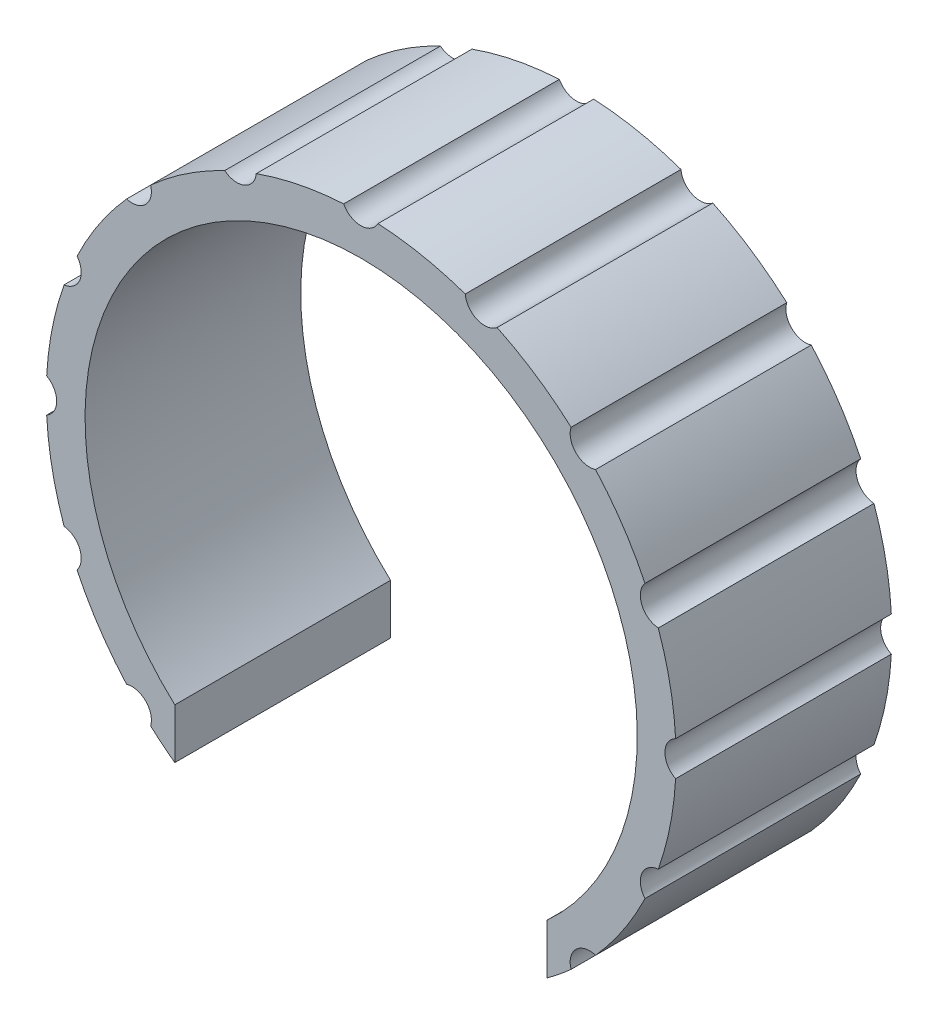
ISO-10303-21;
HEADER;
FILE_DESCRIPTION(('STEP AP214'),'2;1');
FILE_NAME('part.step','',(''),(''),'','','');
FILE_SCHEMA(('AUTOMOTIVE_DESIGN { 1 0 10303 214 1 1 1 1 }'));
ENDSEC;
DATA;
#1=APPLICATION_CONTEXT('core data for automotive mechanical design processes');
#2=APPLICATION_PROTOCOL_DEFINITION('international standard','automotive_design',2000,#1);
#3=PRODUCT_CONTEXT('',#1,'mechanical');
#4=PRODUCT('Part','Part','',(#3));
#5=PRODUCT_RELATED_PRODUCT_CATEGORY('part','',(#4));
#6=PRODUCT_DEFINITION_FORMATION('','',#4);
#7=PRODUCT_DEFINITION_CONTEXT('part definition',#1,'design');
#8=PRODUCT_DEFINITION('design','',#6,#7);
#9=PRODUCT_DEFINITION_SHAPE('','',#8);
#10=(LENGTH_UNIT() NAMED_UNIT(*) SI_UNIT(.MILLI.,.METRE.));
#11=(NAMED_UNIT(*) PLANE_ANGLE_UNIT() SI_UNIT($,.RADIAN.));
#12=(NAMED_UNIT(*) SI_UNIT($,.STERADIAN.) SOLID_ANGLE_UNIT());
#13=UNCERTAINTY_MEASURE_WITH_UNIT(LENGTH_MEASURE(1.E-05),#10,'distance_accuracy_value','');
#14=(GEOMETRIC_REPRESENTATION_CONTEXT(3) GLOBAL_UNCERTAINTY_ASSIGNED_CONTEXT((#13)) GLOBAL_UNIT_ASSIGNED_CONTEXT((#10,
#11,#12)) REPRESENTATION_CONTEXT('',''));
#15=CARTESIAN_POINT('',(0.,0.,0.));
#16=DIRECTION('',(0.,0.,1.));
#17=DIRECTION('',(1.,0.,0.));
#18=AXIS2_PLACEMENT_3D('',#15,#16,#17);
#19=CARTESIAN_POINT('',(-107.548664290788,34.6454824691734,-5.));
#20=DIRECTION('',(0.,0.,1.));
#21=DIRECTION('',(1.,0.,0.));
#22=AXIS2_PLACEMENT_3D('',#19,#20,#21);
#23=CYLINDRICAL_SURFACE('',#22,2.25000000000007);
#24=CARTESIAN_POINT('',(-107.548664290788,34.6454824691734,5.));
#25=DIRECTION('',(0.,0.,-1.));
#26=DIRECTION('',(-1.,0.,0.));
#27=AXIS2_PLACEMENT_3D('',#24,#25,#26);
#28=CIRCLE('',#27,2.25000000000007);
#29=CARTESIAN_POINT('',(-109.789974290933,34.4479236595641,5.));
#30=VERTEX_POINT('',#29);
#31=CARTESIAN_POINT('',(-106.099842397436,32.9240252023956,5.));
#32=VERTEX_POINT('',#31);
#33=EDGE_CURVE('E521',#30,#32,#28,.F.);
#34=ORIENTED_EDGE('',*,*,#33,.F.);
#35=DIRECTION('',(0.,0.,1.));
#36=VECTOR('',#35,1.);
#37=CARTESIAN_POINT('',(-109.789974290933,34.4479236595641,17.5));
#38=LINE('',#37,#36);
#39=CARTESIAN_POINT('',(-109.789974290933,34.4479236595641,30.));
#40=VERTEX_POINT('',#39);
#41=EDGE_CURVE('E438',#40,#30,#38,.F.);
#42=ORIENTED_EDGE('',*,*,#41,.F.);
#43=CARTESIAN_POINT('',(-107.548664290788,34.6454824691734,30.));
#44=DIRECTION('',(0.,0.,1.));
#45=DIRECTION('',(1.,0.,0.));
#46=AXIS2_PLACEMENT_3D('',#43,#44,#45);
#47=CIRCLE('',#46,2.25000000000007);
#48=CARTESIAN_POINT('',(-106.099842397436,32.9240252023956,30.));
#49=VERTEX_POINT('',#48);
#50=EDGE_CURVE('E325',#40,#49,#47,.T.);
#51=ORIENTED_EDGE('',*,*,#50,.T.);
#52=DIRECTION('',(0.,0.,1.));
#53=VECTOR('',#52,1.);
#54=CARTESIAN_POINT('',(-106.099842397436,32.9240252023956,17.5));
#55=LINE('',#54,#53);
#56=EDGE_CURVE('E57',#32,#49,#55,.T.);
#57=ORIENTED_EDGE('',*,*,#56,.F.);
#58=EDGE_LOOP('',(#34,#42,#51,#57));
#59=FACE_BOUND('',#58,.T.);
#60=ADVANCED_FACE('F48',(#59),#23,.F.);
#61=CARTESIAN_POINT('',(-121.899293004479,37.5,-5.));
#62=DIRECTION('',(0.,0.,1.));
#63=DIRECTION('',(1.,0.,0.));
#64=AXIS2_PLACEMENT_3D('',#61,#62,#63);
#65=CYLINDRICAL_SURFACE('',#64,2.25);
#66=CARTESIAN_POINT('',(-121.899293004479,37.5,5.));
#67=DIRECTION('',(0.,0.,-1.));
#68=DIRECTION('',(-1.,0.,0.));
#69=AXIS2_PLACEMENT_3D('',#66,#67,#68);
#70=CIRCLE('',#69,2.25);
#71=CARTESIAN_POINT('',(-123.885834411166,36.4435184622924,5.));
#72=VERTEX_POINT('',#71);
#73=CARTESIAN_POINT('',(-119.910321193675,36.4481011760507,5.));
#74=VERTEX_POINT('',#73);
#75=EDGE_CURVE('E536',#72,#74,#70,.F.);
#76=ORIENTED_EDGE('',*,*,#75,.F.);
#77=DIRECTION('',(0.,0.,1.));
#78=VECTOR('',#77,1.);
#79=CARTESIAN_POINT('',(-123.885834411166,36.4435184622924,17.5));
#80=LINE('',#79,#78);
#81=CARTESIAN_POINT('',(-123.885834411166,36.4435184622924,30.));
#82=VERTEX_POINT('',#81);
#83=EDGE_CURVE('E431',#82,#72,#80,.F.);
#84=ORIENTED_EDGE('',*,*,#83,.F.);
#85=CARTESIAN_POINT('',(-121.899293004479,37.5,30.));
#86=DIRECTION('',(0.,0.,1.));
#87=DIRECTION('',(1.,0.,0.));
#88=AXIS2_PLACEMENT_3D('',#85,#86,#87);
#89=CIRCLE('',#88,2.25);
#90=CARTESIAN_POINT('',(-119.910321193675,36.4481011760507,30.));
#91=VERTEX_POINT('',#90);
#92=EDGE_CURVE('E292',#82,#91,#89,.T.);
#93=ORIENTED_EDGE('',*,*,#92,.T.);
#94=DIRECTION('',(0.,0.,1.));
#95=VECTOR('',#94,1.);
#96=CARTESIAN_POINT('',(-119.910321193675,36.4481011760506,17.5));
#97=LINE('',#96,#95);
#98=EDGE_CURVE('E435',#74,#91,#97,.T.);
#99=ORIENTED_EDGE('',*,*,#98,.F.);
#100=EDGE_LOOP('',(#76,#84,#93,#99));
#101=FACE_BOUND('',#100,.T.);
#102=ADVANCED_FACE('F582',(#101),#65,.F.);
#103=CARTESIAN_POINT('',(-136.24992171817,34.6454824691734,-5.));
#104=DIRECTION('',(0.,0.,1.));
#105=DIRECTION('',(1.,0.,0.));
#106=AXIS2_PLACEMENT_3D('',#103,#104,#105);
#107=CYLINDRICAL_SURFACE('',#106,2.25);
#108=CARTESIAN_POINT('',(-136.24992171817,34.6454824691734,5.));
#109=DIRECTION('',(0.,0.,-1.));
#110=DIRECTION('',(-1.,0.,0.));
#111=AXIS2_PLACEMENT_3D('',#108,#109,#110);
#112=CIRCLE('',#111,2.25);
#113=CARTESIAN_POINT('',(-137.66698836935,32.897791962787,5.));
#114=VERTEX_POINT('',#113);
#115=CARTESIAN_POINT('',(-134.01160780363,34.4164610291744,5.));
#116=VERTEX_POINT('',#115);
#117=EDGE_CURVE('E533',#114,#116,#112,.F.);
#118=ORIENTED_EDGE('',*,*,#117,.F.);
#119=DIRECTION('',(0.,0.,1.));
#120=VECTOR('',#119,1.);
#121=CARTESIAN_POINT('',(-137.66698836935,32.8977919627869,17.5));
#122=LINE('',#121,#120);
#123=CARTESIAN_POINT('',(-137.66698836935,32.8977919627869,30.));
#124=VERTEX_POINT('',#123);
#125=EDGE_CURVE('E424',#124,#114,#122,.F.);
#126=ORIENTED_EDGE('',*,*,#125,.F.);
#127=CARTESIAN_POINT('',(-136.24992171817,34.6454824691734,30.));
#128=DIRECTION('',(0.,0.,1.));
#129=DIRECTION('',(1.,0.,0.));
#130=AXIS2_PLACEMENT_3D('',#127,#128,#129);
#131=CIRCLE('',#130,2.25);
#132=CARTESIAN_POINT('',(-134.01160780363,34.4164610291744,30.));
#133=VERTEX_POINT('',#132);
#134=EDGE_CURVE('E314',#124,#133,#131,.T.);
#135=ORIENTED_EDGE('',*,*,#134,.T.);
#136=DIRECTION('',(0.,0.,1.));
#137=VECTOR('',#136,1.);
#138=CARTESIAN_POINT('',(-134.01160780363,34.4164610291744,17.5));
#139=LINE('',#138,#137);
#140=EDGE_CURVE('E428',#116,#133,#139,.T.);
#141=ORIENTED_EDGE('',*,*,#140,.F.);
#142=EDGE_LOOP('',(#118,#126,#135,#141));
#143=FACE_BOUND('',#142,.T.);
#144=ADVANCED_FACE('F590',(#143),#107,.F.);
#145=CARTESIAN_POINT('',(-148.415797298974,26.5165042944957,-5.));
#146=DIRECTION('',(0.,0.,1.));
#147=DIRECTION('',(1.,0.,0.));
#148=AXIS2_PLACEMENT_3D('',#145,#146,#147);
#149=CYLINDRICAL_SURFACE('',#148,2.24999999999995);
#150=CARTESIAN_POINT('',(-148.415797298974,26.5165042944957,5.));
#151=DIRECTION('',(0.,0.,-1.));
#152=DIRECTION('',(-1.,0.,0.));
#153=AXIS2_PLACEMENT_3D('',#150,#151,#152);
#154=CIRCLE('',#153,2.24999999999995);
#155=CARTESIAN_POINT('',(-149.041845728203,24.3553556729847,5.));
#156=VERTEX_POINT('',#155);
#157=CARTESIAN_POINT('',(-146.255671305325,27.1460721554636,5.));
#158=VERTEX_POINT('',#157);
#159=EDGE_CURVE('E530',#156,#158,#154,.F.);
#160=ORIENTED_EDGE('',*,*,#159,.F.);
#161=DIRECTION('',(0.,0.,1.));
#162=VECTOR('',#161,1.);
#163=CARTESIAN_POINT('',(-149.041845728203,24.3553556729847,17.5));
#164=LINE('',#163,#162);
#165=CARTESIAN_POINT('',(-149.041845728203,24.3553556729847,30.));
#166=VERTEX_POINT('',#165);
#167=EDGE_CURVE('E417',#166,#156,#164,.F.);
#168=ORIENTED_EDGE('',*,*,#167,.F.);
#169=CARTESIAN_POINT('',(-148.415797298974,26.5165042944957,30.));
#170=DIRECTION('',(0.,0.,1.));
#171=DIRECTION('',(1.,0.,0.));
#172=AXIS2_PLACEMENT_3D('',#169,#170,#171);
#173=CIRCLE('',#172,2.24999999999995);
#174=CARTESIAN_POINT('',(-146.255671305325,27.1460721554636,30.));
#175=VERTEX_POINT('',#174);
#176=EDGE_CURVE('E310',#166,#175,#173,.T.);
#177=ORIENTED_EDGE('',*,*,#176,.T.);
#178=DIRECTION('',(0.,0.,1.));
#179=VECTOR('',#178,1.);
#180=CARTESIAN_POINT('',(-146.255671305325,27.1460721554636,17.5));
#181=LINE('',#180,#179);
#182=EDGE_CURVE('E421',#158,#175,#181,.T.);
#183=ORIENTED_EDGE('',*,*,#182,.F.);
#184=EDGE_LOOP('',(#160,#168,#177,#183));
#185=FACE_BOUND('',#184,.T.);
#186=ADVANCED_FACE('F598',(#185),#149,.F.);
#187=CARTESIAN_POINT('',(-156.544775473652,14.3506287136912,-5.));
#188=DIRECTION('',(0.,0.,1.));
#189=DIRECTION('',(1.,0.,0.));
#190=AXIS2_PLACEMENT_3D('',#187,#188,#189);
#191=CYLINDRICAL_SURFACE('',#190,2.25000000000003);
#192=CARTESIAN_POINT('',(-156.544775473652,14.3506287136912,5.));
#193=DIRECTION('',(0.,0.,-1.));
#194=DIRECTION('',(-1.,0.,0.));
#195=AXIS2_PLACEMENT_3D('',#192,#193,#194);
#196=CIRCLE('',#195,2.25000000000003);
#197=CARTESIAN_POINT('',(-156.286648343464,12.1154843369985,5.));
#198=VERTEX_POINT('',#197);
#199=CARTESIAN_POINT('',(-154.782999029718,15.7501442590137,5.));
#200=VERTEX_POINT('',#199);
#201=EDGE_CURVE('E527',#198,#200,#196,.F.);
#202=ORIENTED_EDGE('',*,*,#201,.F.);
#203=DIRECTION('',(0.,0.,1.));
#204=VECTOR('',#203,1.);
#205=CARTESIAN_POINT('',(-156.286648343464,12.1154843369985,17.5));
#206=LINE('',#205,#204);
#207=CARTESIAN_POINT('',(-156.286648343464,12.1154843369985,30.));
#208=VERTEX_POINT('',#207);
#209=EDGE_CURVE('E410',#208,#198,#206,.F.);
#210=ORIENTED_EDGE('',*,*,#209,.F.);
#211=CARTESIAN_POINT('',(-156.544775473652,14.3506287136912,30.));
#212=DIRECTION('',(0.,0.,1.));
#213=DIRECTION('',(1.,0.,0.));
#214=AXIS2_PLACEMENT_3D('',#211,#212,#213);
#215=CIRCLE('',#214,2.25000000000003);
#216=CARTESIAN_POINT('',(-154.782999029718,15.7501442590137,30.));
#217=VERTEX_POINT('',#216);
#218=EDGE_CURVE('E306',#208,#217,#215,.T.);
#219=ORIENTED_EDGE('',*,*,#218,.T.);
#220=DIRECTION('',(0.,0.,1.));
#221=VECTOR('',#220,1.);
#222=CARTESIAN_POINT('',(-154.782999029718,15.7501442590137,17.5));
#223=LINE('',#222,#221);
#224=EDGE_CURVE('E414',#200,#217,#223,.T.);
#225=ORIENTED_EDGE('',*,*,#224,.F.);
#226=EDGE_LOOP('',(#202,#210,#219,#225));
#227=FACE_BOUND('',#226,.T.);
#228=ADVANCED_FACE('F606',(#227),#191,.F.);
#229=CARTESIAN_POINT('',(-159.399293004478,5.969E-13,-5.));
#230=DIRECTION('',(0.,0.,1.));
#231=DIRECTION('',(1.,0.,0.));
#232=AXIS2_PLACEMENT_3D('',#229,#230,#231);
#233=CYLINDRICAL_SURFACE('',#232,2.25);
#234=CARTESIAN_POINT('',(-159.399293004478,5.969E-13,5.));
#235=DIRECTION('',(0.,0.,-1.));
#236=DIRECTION('',(-1.,0.,0.));
#237=AXIS2_PLACEMENT_3D('',#234,#235,#236);
#238=CIRCLE('',#237,2.25);
#239=CARTESIAN_POINT('',(-158.30313743239,-1.96492823323808,5.));
#240=VERTEX_POINT('',#239);
#241=CARTESIAN_POINT('',(-158.30313743239,1.96492823323925,5.));
#242=VERTEX_POINT('',#241);
#243=EDGE_CURVE('E519',#240,#242,#238,.F.);
#244=ORIENTED_EDGE('',*,*,#243,.F.);
#245=DIRECTION('',(0.,0.,1.));
#246=VECTOR('',#245,1.);
#247=CARTESIAN_POINT('',(-158.30313743239,-1.96492823323809,17.5));
#248=LINE('',#247,#246);
#249=CARTESIAN_POINT('',(-158.30313743239,-1.96492823323809,30.));
#250=VERTEX_POINT('',#249);
#251=EDGE_CURVE('E403',#250,#240,#248,.F.);
#252=ORIENTED_EDGE('',*,*,#251,.F.);
#253=CARTESIAN_POINT('',(-159.399293004478,5.969E-13,30.));
#254=DIRECTION('',(0.,0.,1.));
#255=DIRECTION('',(1.,0.,0.));
#256=AXIS2_PLACEMENT_3D('',#253,#254,#255);
#257=CIRCLE('',#256,2.25);
#258=CARTESIAN_POINT('',(-158.30313743239,1.96492823323925,30.));
#259=VERTEX_POINT('',#258);
#260=EDGE_CURVE('E302',#250,#259,#257,.T.);
#261=ORIENTED_EDGE('',*,*,#260,.T.);
#262=DIRECTION('',(0.,0.,1.));
#263=VECTOR('',#262,1.);
#264=CARTESIAN_POINT('',(-158.30313743239,1.96492823323925,17.5));
#265=LINE('',#264,#263);
#266=EDGE_CURVE('E407',#242,#259,#265,.T.);
#267=ORIENTED_EDGE('',*,*,#266,.F.);
#268=EDGE_LOOP('',(#244,#252,#261,#267));
#269=FACE_BOUND('',#268,.T.);
#270=ADVANCED_FACE('F614',(#269),#233,.F.);
#271=CARTESIAN_POINT('',(-156.544775473652,-14.3506287136901,-5.));
#272=DIRECTION('',(0.,0.,1.));
#273=DIRECTION('',(1.,0.,0.));
#274=AXIS2_PLACEMENT_3D('',#271,#272,#273);
#275=CYLINDRICAL_SURFACE('',#274,2.25000000000003);
#276=CARTESIAN_POINT('',(-156.544775473652,-14.3506287136901,5.));
#277=DIRECTION('',(0.,0.,-1.));
#278=DIRECTION('',(-1.,0.,0.));
#279=AXIS2_PLACEMENT_3D('',#276,#277,#278);
#280=CIRCLE('',#279,2.25000000000003);
#281=CARTESIAN_POINT('',(-154.782999029718,-15.750144259013,5.));
#282=VERTEX_POINT('',#281);
#283=CARTESIAN_POINT('',(-156.286648343464,-12.1154843369973,5.));
#284=VERTEX_POINT('',#283);
#285=EDGE_CURVE('E514',#282,#284,#280,.F.);
#286=ORIENTED_EDGE('',*,*,#285,.F.);
#287=DIRECTION('',(0.,0.,1.));
#288=VECTOR('',#287,1.);
#289=CARTESIAN_POINT('',(-154.782999029718,-15.750144259013,17.5));
#290=LINE('',#289,#288);
#291=CARTESIAN_POINT('',(-154.782999029718,-15.750144259013,30.));
#292=VERTEX_POINT('',#291);
#293=EDGE_CURVE('E396',#292,#282,#290,.F.);
#294=ORIENTED_EDGE('',*,*,#293,.F.);
#295=CARTESIAN_POINT('',(-156.544775473652,-14.3506287136901,30.));
#296=DIRECTION('',(0.,0.,1.));
#297=DIRECTION('',(1.,0.,0.));
#298=AXIS2_PLACEMENT_3D('',#295,#296,#297);
#299=CIRCLE('',#298,2.25000000000003);
#300=CARTESIAN_POINT('',(-156.286648343464,-12.1154843369973,30.));
#301=VERTEX_POINT('',#300);
#302=EDGE_CURVE('E298',#292,#301,#299,.T.);
#303=ORIENTED_EDGE('',*,*,#302,.T.);
#304=DIRECTION('',(0.,0.,1.));
#305=VECTOR('',#304,1.);
#306=CARTESIAN_POINT('',(-156.286648343464,-12.1154843369973,17.5));
#307=LINE('',#306,#305);
#308=EDGE_CURVE('E400',#284,#301,#307,.T.);
#309=ORIENTED_EDGE('',*,*,#308,.F.);
#310=EDGE_LOOP('',(#286,#294,#303,#309));
#311=FACE_BOUND('',#310,.T.);
#312=ADVANCED_FACE('F621',(#311),#275,.F.);
#313=CARTESIAN_POINT('',(-148.415797298974,-26.5165042944946,-5.));
#314=DIRECTION('',(0.,0.,1.));
#315=DIRECTION('',(1.,0.,0.));
#316=AXIS2_PLACEMENT_3D('',#313,#314,#315);
#317=CYLINDRICAL_SURFACE('',#316,2.25000000000003);
#318=CARTESIAN_POINT('',(-148.415797298974,-26.5165042944946,5.));
#319=DIRECTION('',(0.,0.,-1.));
#320=DIRECTION('',(-1.,0.,0.));
#321=AXIS2_PLACEMENT_3D('',#318,#319,#320);
#322=CIRCLE('',#321,2.25000000000003);
#323=CARTESIAN_POINT('',(-146.255671305326,-27.1460721554634,5.));
#324=VERTEX_POINT('',#323);
#325=CARTESIAN_POINT('',(-149.041845728204,-24.3553556729837,5.));
#326=VERTEX_POINT('',#325);
#327=EDGE_CURVE('E563',#324,#326,#322,.F.);
#328=ORIENTED_EDGE('',*,*,#327,.F.);
#329=DIRECTION('',(0.,0.,1.));
#330=VECTOR('',#329,1.);
#331=CARTESIAN_POINT('',(-146.255671305326,-27.1460721554634,17.5));
#332=LINE('',#331,#330);
#333=CARTESIAN_POINT('',(-146.255671305326,-27.1460721554634,30.));
#334=VERTEX_POINT('',#333);
#335=EDGE_CURVE('E389',#334,#324,#332,.F.);
#336=ORIENTED_EDGE('',*,*,#335,.F.);
#337=CARTESIAN_POINT('',(-148.415797298974,-26.5165042944946,30.));
#338=DIRECTION('',(0.,0.,1.));
#339=DIRECTION('',(1.,0.,0.));
#340=AXIS2_PLACEMENT_3D('',#337,#338,#339);
#341=CIRCLE('',#340,2.25000000000003);
#342=CARTESIAN_POINT('',(-149.041845728204,-24.3553556729837,30.));
#343=VERTEX_POINT('',#342);
#344=EDGE_CURVE('E293',#334,#343,#341,.T.);
#345=ORIENTED_EDGE('',*,*,#344,.T.);
#346=DIRECTION('',(0.,0.,1.));
#347=VECTOR('',#346,1.);
#348=CARTESIAN_POINT('',(-149.041845728204,-24.3553556729837,17.5));
#349=LINE('',#348,#347);
#350=EDGE_CURVE('E393',#326,#343,#349,.T.);
#351=ORIENTED_EDGE('',*,*,#350,.F.);
#352=EDGE_LOOP('',(#328,#336,#345,#351));
#353=FACE_BOUND('',#352,.T.);
#354=ADVANCED_FACE('F626',(#353),#317,.F.);
#355=CARTESIAN_POINT('',(-95.3827887099839,-26.5165042944946,-5.));
#356=DIRECTION('',(0.,0.,1.));
#357=DIRECTION('',(1.,0.,0.));
#358=AXIS2_PLACEMENT_3D('',#355,#356,#357);
#359=CYLINDRICAL_SURFACE('',#358,2.24999999999996);
#360=CARTESIAN_POINT('',(-95.3827887099839,-26.5165042944946,5.));
#361=DIRECTION('',(0.,0.,-1.));
#362=DIRECTION('',(-1.,0.,0.));
#363=AXIS2_PLACEMENT_3D('',#360,#361,#362);
#364=CIRCLE('',#363,2.24999999999996);
#365=CARTESIAN_POINT('',(-94.6889382576577,-24.3761605020616,5.));
#366=VERTEX_POINT('',#365);
#367=CARTESIAN_POINT('',(-97.5242617001624,-27.2068617615622,5.));
#368=VERTEX_POINT('',#367);
#369=EDGE_CURVE('E271',#366,#368,#364,.F.);
#370=ORIENTED_EDGE('',*,*,#369,.F.);
#371=DIRECTION('',(0.,0.,1.));
#372=VECTOR('',#371,1.);
#373=CARTESIAN_POINT('',(-94.6889382576577,-24.3761605020616,17.5));
#374=LINE('',#373,#372);
#375=CARTESIAN_POINT('',(-94.6889382576577,-24.3761605020616,30.));
#376=VERTEX_POINT('',#375);
#377=EDGE_CURVE('E381',#376,#366,#374,.F.);
#378=ORIENTED_EDGE('',*,*,#377,.F.);
#379=CARTESIAN_POINT('',(-95.3827887099839,-26.5165042944946,30.));
#380=DIRECTION('',(0.,0.,1.));
#381=DIRECTION('',(1.,0.,0.));
#382=AXIS2_PLACEMENT_3D('',#379,#380,#381);
#383=CIRCLE('',#382,2.24999999999996);
#384=CARTESIAN_POINT('',(-97.5242617001624,-27.2068617615622,30.));
#385=VERTEX_POINT('',#384);
#386=EDGE_CURVE('E297',#376,#385,#383,.T.);
#387=ORIENTED_EDGE('',*,*,#386,.T.);
#388=DIRECTION('',(0.,0.,1.));
#389=VECTOR('',#388,1.);
#390=CARTESIAN_POINT('',(-97.5242617001624,-27.2068617615622,17.5));
#391=LINE('',#390,#389);
#392=EDGE_CURVE('E385',#368,#385,#391,.T.);
#393=ORIENTED_EDGE('',*,*,#392,.F.);
#394=EDGE_LOOP('',(#370,#378,#387,#393));
#395=FACE_BOUND('',#394,.T.);
#396=ADVANCED_FACE('F561',(#395),#359,.F.);
#397=CARTESIAN_POINT('',(-87.2538105353063,-14.3506287136901,-5.));
#398=DIRECTION('',(0.,0.,1.));
#399=DIRECTION('',(1.,0.,0.));
#400=AXIS2_PLACEMENT_3D('',#397,#398,#399);
#401=CYLINDRICAL_SURFACE('',#400,2.24999999999997);
#402=CARTESIAN_POINT('',(-87.2538105353063,-14.3506287136901,5.));
#403=DIRECTION('',(0.,0.,-1.));
#404=DIRECTION('',(-1.,0.,0.));
#405=AXIS2_PLACEMENT_3D('',#402,#403,#404);
#406=CIRCLE('',#405,2.24999999999997);
#407=CARTESIAN_POINT('',(-87.4224841671241,-12.1069600202486,5.));
#408=VERTEX_POINT('',#407);
#409=CARTESIAN_POINT('',(-88.9608893642003,-15.8163646626052,5.));
#410=VERTEX_POINT('',#409);
#411=EDGE_CURVE('E512',#408,#410,#406,.F.);
#412=ORIENTED_EDGE('',*,*,#411,.F.);
#413=DIRECTION('',(0.,0.,1.));
#414=VECTOR('',#413,1.);
#415=CARTESIAN_POINT('',(-87.4224841671241,-12.1069600202486,17.5));
#416=LINE('',#415,#414);
#417=CARTESIAN_POINT('',(-87.4224841671241,-12.1069600202486,30.));
#418=VERTEX_POINT('',#417);
#419=EDGE_CURVE('E375',#418,#408,#416,.F.);
#420=ORIENTED_EDGE('',*,*,#419,.F.);
#421=CARTESIAN_POINT('',(-87.2538105353063,-14.3506287136901,30.));
#422=DIRECTION('',(0.,0.,1.));
#423=DIRECTION('',(1.,0.,0.));
#424=AXIS2_PLACEMENT_3D('',#421,#422,#423);
#425=CIRCLE('',#424,2.24999999999997);
#426=CARTESIAN_POINT('',(-88.9608893642003,-15.8163646626052,30.));
#427=VERTEX_POINT('',#426);
#428=EDGE_CURVE('E333',#418,#427,#425,.T.);
#429=ORIENTED_EDGE('',*,*,#428,.T.);
#430=DIRECTION('',(0.,0.,1.));
#431=VECTOR('',#430,1.);
#432=CARTESIAN_POINT('',(-88.9608893642003,-15.8163646626052,17.5));
#433=LINE('',#432,#431);
#434=EDGE_CURVE('E72',#410,#427,#433,.T.);
#435=ORIENTED_EDGE('',*,*,#434,.F.);
#436=EDGE_LOOP('',(#412,#420,#429,#435));
#437=FACE_BOUND('',#436,.T.);
#438=ADVANCED_FACE('F511',(#437),#401,.F.);
#439=CARTESIAN_POINT('',(-84.3992930044792,0.,-5.));
#440=DIRECTION('',(0.,0.,1.));
#441=DIRECTION('',(1.,0.,0.));
#442=AXIS2_PLACEMENT_3D('',#439,#440,#441);
#443=CYLINDRICAL_SURFACE('',#442,2.25);
#444=CARTESIAN_POINT('',(-84.3992930044792,0.,5.));
#445=DIRECTION('',(0.,0.,-1.));
#446=DIRECTION('',(-1.,0.,0.));
#447=AXIS2_PLACEMENT_3D('',#444,#445,#446);
#448=CIRCLE('',#447,2.25);
#449=CARTESIAN_POINT('',(-85.4114237372744,2.00950028109764,5.));
#450=VERTEX_POINT('',#449);
#451=CARTESIAN_POINT('',(-85.4114237372744,-2.00950028109759,5.));
#452=VERTEX_POINT('',#451);
#453=EDGE_CURVE('E515',#450,#452,#448,.F.);
#454=ORIENTED_EDGE('',*,*,#453,.F.);
#455=DIRECTION('',(0.,0.,1.));
#456=VECTOR('',#455,1.);
#457=CARTESIAN_POINT('',(-85.4114237372744,2.00950028109764,17.5));
#458=LINE('',#457,#456);
#459=CARTESIAN_POINT('',(-85.4114237372744,2.00950028109764,30.));
#460=VERTEX_POINT('',#459);
#461=EDGE_CURVE('E369',#460,#450,#458,.F.);
#462=ORIENTED_EDGE('',*,*,#461,.F.);
#463=CARTESIAN_POINT('',(-84.3992930044792,0.,30.));
#464=DIRECTION('',(0.,0.,1.));
#465=DIRECTION('',(1.,0.,0.));
#466=AXIS2_PLACEMENT_3D('',#463,#464,#465);
#467=CIRCLE('',#466,2.25);
#468=CARTESIAN_POINT('',(-85.4114237372744,-2.00950028109758,30.));
#469=VERTEX_POINT('',#468);
#470=EDGE_CURVE('E330',#460,#469,#467,.T.);
#471=ORIENTED_EDGE('',*,*,#470,.T.);
#472=DIRECTION('',(0.,0.,1.));
#473=VECTOR('',#472,1.);
#474=CARTESIAN_POINT('',(-85.4114237372744,-2.00950028109758,17.5));
#475=LINE('',#474,#473);
#476=EDGE_CURVE('E64',#452,#469,#475,.T.);
#477=ORIENTED_EDGE('',*,*,#476,.F.);
#478=EDGE_LOOP('',(#454,#462,#471,#477));
#479=FACE_BOUND('',#478,.T.);
#480=ADVANCED_FACE('F651',(#479),#443,.F.);
#481=CARTESIAN_POINT('',(-87.2538105353063,14.3506287136913,-5.));
#482=DIRECTION('',(0.,0.,1.));
#483=DIRECTION('',(1.,0.,0.));
#484=AXIS2_PLACEMENT_3D('',#481,#482,#483);
#485=CYLINDRICAL_SURFACE('',#484,2.25000000000002);
#486=CARTESIAN_POINT('',(-87.2538105353063,14.3506287136913,5.));
#487=DIRECTION('',(0.,0.,-1.));
#488=DIRECTION('',(-1.,0.,0.));
#489=AXIS2_PLACEMENT_3D('',#486,#487,#488);
#490=CIRCLE('',#489,2.25000000000002);
#491=CARTESIAN_POINT('',(-88.9608893642007,15.816364662606,5.));
#492=VERTEX_POINT('',#491);
#493=CARTESIAN_POINT('',(-87.4224841671245,12.1069600202498,5.));
#494=VERTEX_POINT('',#493);
#495=EDGE_CURVE('E571',#492,#494,#490,.F.);
#496=ORIENTED_EDGE('',*,*,#495,.F.);
#497=DIRECTION('',(0.,0.,1.));
#498=VECTOR('',#497,1.);
#499=CARTESIAN_POINT('',(-88.9608893642007,15.816364662606,17.5));
#500=LINE('',#499,#498);
#501=CARTESIAN_POINT('',(-88.9608893642007,15.816364662606,30.));
#502=VERTEX_POINT('',#501);
#503=EDGE_CURVE('E362',#502,#492,#500,.F.);
#504=ORIENTED_EDGE('',*,*,#503,.F.);
#505=CARTESIAN_POINT('',(-87.2538105353063,14.3506287136913,30.));
#506=DIRECTION('',(0.,0.,1.));
#507=DIRECTION('',(1.,0.,0.));
#508=AXIS2_PLACEMENT_3D('',#505,#506,#507);
#509=CIRCLE('',#508,2.25000000000002);
#510=CARTESIAN_POINT('',(-87.4224841671245,12.1069600202498,30.));
#511=VERTEX_POINT('',#510);
#512=EDGE_CURVE('E326',#502,#511,#509,.T.);
#513=ORIENTED_EDGE('',*,*,#512,.T.);
#514=DIRECTION('',(0.,0.,1.));
#515=VECTOR('',#514,1.);
#516=CARTESIAN_POINT('',(-87.4224841671245,12.1069600202498,17.5));
#517=LINE('',#516,#515);
#518=EDGE_CURVE('E366',#494,#511,#517,.T.);
#519=ORIENTED_EDGE('',*,*,#518,.F.);
#520=EDGE_LOOP('',(#496,#504,#513,#519));
#521=FACE_BOUND('',#520,.T.);
#522=ADVANCED_FACE('F646',(#521),#485,.F.);
#523=CARTESIAN_POINT('',(-95.3827887099841,26.5165042944958,-5.));
#524=DIRECTION('',(0.,0.,1.));
#525=DIRECTION('',(1.,0.,0.));
#526=AXIS2_PLACEMENT_3D('',#523,#524,#525);
#527=CYLINDRICAL_SURFACE('',#526,2.25000000000006);
#528=CARTESIAN_POINT('',(-95.3827887099841,26.5165042944958,5.));
#529=DIRECTION('',(0.,0.,-1.));
#530=DIRECTION('',(-1.,0.,0.));
#531=AXIS2_PLACEMENT_3D('',#528,#529,#530);
#532=CIRCLE('',#531,2.25000000000006);
#533=CARTESIAN_POINT('',(-97.5242617001629,27.2068617615626,5.));
#534=VERTEX_POINT('',#533);
#535=CARTESIAN_POINT('',(-94.6889382576585,24.3761605020625,5.));
#536=VERTEX_POINT('',#535);
#537=EDGE_CURVE('E566',#534,#536,#532,.F.);
#538=ORIENTED_EDGE('',*,*,#537,.F.);
#539=DIRECTION('',(0.,0.,1.));
#540=VECTOR('',#539,1.);
#541=CARTESIAN_POINT('',(-97.5242617001629,27.2068617615626,17.5));
#542=LINE('',#541,#540);
#543=CARTESIAN_POINT('',(-97.5242617001629,27.2068617615626,30.));
#544=VERTEX_POINT('',#543);
#545=EDGE_CURVE('E347',#544,#534,#542,.F.);
#546=ORIENTED_EDGE('',*,*,#545,.F.);
#547=CARTESIAN_POINT('',(-95.3827887099841,26.5165042944958,30.));
#548=DIRECTION('',(0.,0.,1.));
#549=DIRECTION('',(1.,0.,0.));
#550=AXIS2_PLACEMENT_3D('',#547,#548,#549);
#551=CIRCLE('',#550,2.25000000000006);
#552=CARTESIAN_POINT('',(-94.6889382576585,24.3761605020625,30.));
#553=VERTEX_POINT('',#552);
#554=EDGE_CURVE('E321',#544,#553,#551,.T.);
#555=ORIENTED_EDGE('',*,*,#554,.T.);
#556=DIRECTION('',(0.,0.,1.));
#557=VECTOR('',#556,1.);
#558=CARTESIAN_POINT('',(-94.6889382576585,24.3761605020625,17.5));
#559=LINE('',#558,#557);
#560=EDGE_CURVE('E359',#536,#553,#559,.T.);
#561=ORIENTED_EDGE('',*,*,#560,.F.);
#562=EDGE_LOOP('',(#538,#546,#555,#561));
#563=FACE_BOUND('',#562,.T.);
#564=ADVANCED_FACE('F642',(#563),#527,.F.);
#565=CARTESIAN_POINT('',(-121.856065436985,0.,35.));
#566=DIRECTION('',(0.,0.,-1.));
#567=DIRECTION('',(-1.,0.,0.));
#568=AXIS2_PLACEMENT_3D('',#565,#566,#567);
#569=CYLINDRICAL_SURFACE('',#568,32.);
#570=DIRECTION('',(0.,0.,-1.));
#571=VECTOR('',#570,1.);
#572=CARTESIAN_POINT('',(-143.448251029427,-23.6173140162363,35.));
#573=LINE('',#572,#571);
#574=CARTESIAN_POINT('',(-143.448251029427,-23.6173140162363,5.));
#575=VERTEX_POINT('',#574);
#576=CARTESIAN_POINT('',(-143.448251029427,-23.6173140162363,30.));
#577=VERTEX_POINT('',#576);
#578=EDGE_CURVE('E269',#575,#577,#573,.F.);
#579=ORIENTED_EDGE('',*,*,#578,.F.);
#580=CARTESIAN_POINT('',(-121.856065436985,0.,5.));
#581=DIRECTION('',(0.,0.,-1.));
#582=DIRECTION('',(-1.,0.,0.));
#583=AXIS2_PLACEMENT_3D('',#580,#581,#582);
#584=CIRCLE('',#583,32.);
#585=CARTESIAN_POINT('',(-100.318386170668,-23.6670313267484,5.));
#586=VERTEX_POINT('',#585);
#587=EDGE_CURVE('E252',#575,#586,#584,.T.);
#588=ORIENTED_EDGE('',*,*,#587,.T.);
#589=DIRECTION('',(0.,0.,-1.));
#590=VECTOR('',#589,1.);
#591=CARTESIAN_POINT('',(-100.318386170668,-23.6670313267484,35.));
#592=LINE('',#591,#590);
#593=CARTESIAN_POINT('',(-100.318386170668,-23.6670313267484,30.));
#594=VERTEX_POINT('',#593);
#595=EDGE_CURVE('E267',#594,#586,#592,.T.);
#596=ORIENTED_EDGE('',*,*,#595,.F.);
#597=CARTESIAN_POINT('',(-121.856065436985,0.,30.));
#598=DIRECTION('',(0.,0.,-1.));
#599=DIRECTION('',(-1.,0.,0.));
#600=AXIS2_PLACEMENT_3D('',#597,#598,#599);
#601=CIRCLE('',#600,32.);
#602=EDGE_CURVE('E12',#594,#577,#601,.F.);
#603=ORIENTED_EDGE('',*,*,#602,.T.);
#604=EDGE_LOOP('',(#579,#588,#596,#603));
#605=FACE_BOUND('',#604,.T.);
#606=ADVANCED_FACE('F266',(#605),#569,.F.);
#607=CARTESIAN_POINT('',(-121.856065436985,0.,5.));
#608=DIRECTION('',(0.,0.,1.));
#609=DIRECTION('',(1.,0.,0.));
#610=AXIS2_PLACEMENT_3D('',#607,#608,#609);
#611=CYLINDRICAL_SURFACE('',#610,36.5);
#612=CARTESIAN_POINT('',(-121.856065436985,0.,30.));
#613=DIRECTION('',(0.,0.,1.));
#614=DIRECTION('',(1.,0.,0.));
#615=AXIS2_PLACEMENT_3D('',#612,#613,#614);
#616=CIRCLE('',#615,36.5);
#617=EDGE_CURVE('E448',#544,#49,#616,.T.);
#618=ORIENTED_EDGE('',*,*,#617,.F.);
#619=ORIENTED_EDGE('',*,*,#545,.T.);
#620=CARTESIAN_POINT('',(-121.856065436985,0.,5.));
#621=DIRECTION('',(0.,0.,1.));
#622=DIRECTION('',(1.,0.,0.));
#623=AXIS2_PLACEMENT_3D('',#620,#621,#622);
#624=CIRCLE('',#623,36.5);
#625=EDGE_CURVE('E449',#534,#32,#624,.T.);
#626=ORIENTED_EDGE('',*,*,#625,.T.);
#627=ORIENTED_EDGE('',*,*,#56,.T.);
#628=EDGE_LOOP('',(#618,#619,#626,#627));
#629=FACE_BOUND('',#628,.T.);
#630=ADVANCED_FACE('F446',(#629),#611,.T.);
#631=ORIENTED_EDGE('',*,*,#560,.T.);
#632=EDGE_CURVE('E354',#502,#553,#616,.T.);
#633=ORIENTED_EDGE('',*,*,#632,.F.);
#634=ORIENTED_EDGE('',*,*,#503,.T.);
#635=EDGE_CURVE('E348',#492,#536,#624,.T.);
#636=ORIENTED_EDGE('',*,*,#635,.T.);
#637=EDGE_LOOP('',(#631,#633,#634,#636));
#638=FACE_BOUND('',#637,.T.);
#639=ADVANCED_FACE('F638',(#638),#611,.T.);
#640=ORIENTED_EDGE('',*,*,#518,.T.);
#641=EDGE_CURVE('E349',#460,#511,#616,.T.);
#642=ORIENTED_EDGE('',*,*,#641,.F.);
#643=ORIENTED_EDGE('',*,*,#461,.T.);
#644=EDGE_CURVE('E343',#450,#494,#624,.T.);
#645=ORIENTED_EDGE('',*,*,#644,.T.);
#646=EDGE_LOOP('',(#640,#642,#643,#645));
#647=FACE_BOUND('',#646,.T.);
#648=ADVANCED_FACE('F649',(#647),#611,.T.);
#649=ORIENTED_EDGE('',*,*,#476,.T.);
#650=EDGE_CURVE('E342',#418,#469,#616,.T.);
#651=ORIENTED_EDGE('',*,*,#650,.F.);
#652=ORIENTED_EDGE('',*,*,#419,.T.);
#653=EDGE_CURVE('E353',#408,#452,#624,.T.);
#654=ORIENTED_EDGE('',*,*,#653,.T.);
#655=EDGE_LOOP('',(#649,#651,#652,#654));
#656=FACE_BOUND('',#655,.T.);
#657=ADVANCED_FACE('F508',(#656),#611,.T.);
#658=ORIENTED_EDGE('',*,*,#434,.T.);
#659=EDGE_CURVE('E496',#376,#427,#616,.T.);
#660=ORIENTED_EDGE('',*,*,#659,.F.);
#661=ORIENTED_EDGE('',*,*,#377,.T.);
#662=EDGE_CURVE('E550',#366,#410,#624,.T.);
#663=ORIENTED_EDGE('',*,*,#662,.T.);
#664=EDGE_LOOP('',(#658,#660,#661,#663));
#665=FACE_BOUND('',#664,.T.);
#666=ADVANCED_FACE('F557',(#665),#611,.T.);
#667=DIRECTION('',(0.,0.,1.));
#668=VECTOR('',#667,1.);
#669=CARTESIAN_POINT('',(-100.325079088745,-29.4731509491588,5.));
#670=LINE('',#669,#668);
#671=CARTESIAN_POINT('',(-100.325079088745,-29.4731509491588,5.));
#672=VERTEX_POINT('',#671);
#673=CARTESIAN_POINT('',(-100.325079088745,-29.4731509491588,30.));
#674=VERTEX_POINT('',#673);
#675=EDGE_CURVE('E277',#672,#674,#670,.T.);
#676=ORIENTED_EDGE('',*,*,#675,.F.);
#677=EDGE_CURVE('E255',#672,#368,#624,.T.);
#678=ORIENTED_EDGE('',*,*,#677,.T.);
#679=ORIENTED_EDGE('',*,*,#392,.T.);
#680=EDGE_CURVE('E355',#674,#385,#616,.T.);
#681=ORIENTED_EDGE('',*,*,#680,.F.);
#682=EDGE_LOOP('',(#676,#678,#679,#681));
#683=FACE_BOUND('',#682,.T.);
#684=ADVANCED_FACE('F758',(#683),#611,.T.);
#685=DIRECTION('',(0.,0.,1.));
#686=VECTOR('',#685,1.);
#687=CARTESIAN_POINT('',(-143.454943947504,-29.4234336386467,5.));
#688=LINE('',#687,#686);
#689=CARTESIAN_POINT('',(-143.454943947504,-29.4234336386467,30.));
#690=VERTEX_POINT('',#689);
#691=CARTESIAN_POINT('',(-143.454943947504,-29.4234336386467,5.));
#692=VERTEX_POINT('',#691);
#693=EDGE_CURVE('E288',#690,#692,#688,.F.);
#694=ORIENTED_EDGE('',*,*,#693,.F.);
#695=EDGE_CURVE('E492',#334,#690,#616,.T.);
#696=ORIENTED_EDGE('',*,*,#695,.F.);
#697=ORIENTED_EDGE('',*,*,#335,.T.);
#698=EDGE_CURVE('E546',#324,#692,#624,.T.);
#699=ORIENTED_EDGE('',*,*,#698,.T.);
#700=EDGE_LOOP('',(#694,#696,#697,#699));
#701=FACE_BOUND('',#700,.T.);
#702=ADVANCED_FACE('F545',(#701),#611,.T.);
#703=ORIENTED_EDGE('',*,*,#350,.T.);
#704=EDGE_CURVE('E487',#292,#343,#616,.T.);
#705=ORIENTED_EDGE('',*,*,#704,.F.);
#706=ORIENTED_EDGE('',*,*,#293,.T.);
#707=EDGE_CURVE('E549',#282,#326,#624,.T.);
#708=ORIENTED_EDGE('',*,*,#707,.T.);
#709=EDGE_LOOP('',(#703,#705,#706,#708));
#710=FACE_BOUND('',#709,.T.);
#711=ADVANCED_FACE('F623',(#710),#611,.T.);
#712=ORIENTED_EDGE('',*,*,#308,.T.);
#713=EDGE_CURVE('E482',#250,#301,#616,.T.);
#714=ORIENTED_EDGE('',*,*,#713,.F.);
#715=ORIENTED_EDGE('',*,*,#251,.T.);
#716=EDGE_CURVE('E554',#240,#284,#624,.T.);
#717=ORIENTED_EDGE('',*,*,#716,.T.);
#718=EDGE_LOOP('',(#712,#714,#715,#717));
#719=FACE_BOUND('',#718,.T.);
#720=ADVANCED_FACE('F616',(#719),#611,.T.);
#721=ORIENTED_EDGE('',*,*,#266,.T.);
#722=EDGE_CURVE('E477',#208,#259,#616,.T.);
#723=ORIENTED_EDGE('',*,*,#722,.F.);
#724=ORIENTED_EDGE('',*,*,#209,.T.);
#725=EDGE_CURVE('E611',#198,#242,#624,.T.);
#726=ORIENTED_EDGE('',*,*,#725,.T.);
#727=EDGE_LOOP('',(#721,#723,#724,#726));
#728=FACE_BOUND('',#727,.T.);
#729=ADVANCED_FACE('F608',(#728),#611,.T.);
#730=ORIENTED_EDGE('',*,*,#224,.T.);
#731=EDGE_CURVE('E472',#166,#217,#616,.T.);
#732=ORIENTED_EDGE('',*,*,#731,.F.);
#733=ORIENTED_EDGE('',*,*,#167,.T.);
#734=EDGE_CURVE('E603',#156,#200,#624,.T.);
#735=ORIENTED_EDGE('',*,*,#734,.T.);
#736=EDGE_LOOP('',(#730,#732,#733,#735));
#737=FACE_BOUND('',#736,.T.);
#738=ADVANCED_FACE('F600',(#737),#611,.T.);
#739=ORIENTED_EDGE('',*,*,#182,.T.);
#740=EDGE_CURVE('E467',#124,#175,#616,.T.);
#741=ORIENTED_EDGE('',*,*,#740,.F.);
#742=ORIENTED_EDGE('',*,*,#125,.T.);
#743=EDGE_CURVE('E595',#114,#158,#624,.T.);
#744=ORIENTED_EDGE('',*,*,#743,.T.);
#745=EDGE_LOOP('',(#739,#741,#742,#744));
#746=FACE_BOUND('',#745,.T.);
#747=ADVANCED_FACE('F592',(#746),#611,.T.);
#748=ORIENTED_EDGE('',*,*,#140,.T.);
#749=EDGE_CURVE('E463',#82,#133,#616,.T.);
#750=ORIENTED_EDGE('',*,*,#749,.F.);
#751=ORIENTED_EDGE('',*,*,#83,.T.);
#752=EDGE_CURVE('E587',#72,#116,#624,.T.);
#753=ORIENTED_EDGE('',*,*,#752,.T.);
#754=EDGE_LOOP('',(#748,#750,#751,#753));
#755=FACE_BOUND('',#754,.T.);
#756=ADVANCED_FACE('F584',(#755),#611,.T.);
#757=ORIENTED_EDGE('',*,*,#98,.T.);
#758=EDGE_CURVE('E460',#40,#91,#616,.T.);
#759=ORIENTED_EDGE('',*,*,#758,.F.);
#760=ORIENTED_EDGE('',*,*,#41,.T.);
#761=EDGE_CURVE('E576',#30,#74,#624,.T.);
#762=ORIENTED_EDGE('',*,*,#761,.T.);
#763=EDGE_LOOP('',(#757,#759,#760,#762));
#764=FACE_BOUND('',#763,.T.);
#765=ADVANCED_FACE('F578',(#764),#611,.T.);
#766=CARTESIAN_POINT('',(0.,0.,30.));
#767=DIRECTION('',(0.,0.,-1.));
#768=DIRECTION('',(-1.,0.,0.));
#769=AXIS2_PLACEMENT_3D('',#766,#767,#768);
#770=PLANE('',#769);
#771=ORIENTED_EDGE('',*,*,#695,.T.);
#772=DIRECTION('',(-0.00115273436730612,-0.999999335601519,0.));
#773=VECTOR('',#772,1.);
#774=CARTESIAN_POINT('',(-143.464225433859,-37.4751413447429,30.));
#775=LINE('',#774,#773);
#776=EDGE_CURVE('E261',#577,#690,#775,.T.);
#777=ORIENTED_EDGE('',*,*,#776,.F.);
#778=ORIENTED_EDGE('',*,*,#602,.F.);
#779=DIRECTION('',(0.00115273436730612,0.999999335601519,0.));
#780=VECTOR('',#779,1.);
#781=CARTESIAN_POINT('',(-100.3343605751,-37.5248586552549,30.));
#782=LINE('',#781,#780);
#783=EDGE_CURVE('E275',#674,#594,#782,.T.);
#784=ORIENTED_EDGE('',*,*,#783,.F.);
#785=ORIENTED_EDGE('',*,*,#680,.T.);
#786=ORIENTED_EDGE('',*,*,#386,.F.);
#787=ORIENTED_EDGE('',*,*,#659,.T.);
#788=ORIENTED_EDGE('',*,*,#428,.F.);
#789=ORIENTED_EDGE('',*,*,#650,.T.);
#790=ORIENTED_EDGE('',*,*,#470,.F.);
#791=ORIENTED_EDGE('',*,*,#641,.T.);
#792=ORIENTED_EDGE('',*,*,#512,.F.);
#793=ORIENTED_EDGE('',*,*,#632,.T.);
#794=ORIENTED_EDGE('',*,*,#554,.F.);
#795=ORIENTED_EDGE('',*,*,#617,.T.);
#796=ORIENTED_EDGE('',*,*,#50,.F.);
#797=ORIENTED_EDGE('',*,*,#758,.T.);
#798=ORIENTED_EDGE('',*,*,#92,.F.);
#799=ORIENTED_EDGE('',*,*,#749,.T.);
#800=ORIENTED_EDGE('',*,*,#134,.F.);
#801=ORIENTED_EDGE('',*,*,#740,.T.);
#802=ORIENTED_EDGE('',*,*,#176,.F.);
#803=ORIENTED_EDGE('',*,*,#731,.T.);
#804=ORIENTED_EDGE('',*,*,#218,.F.);
#805=ORIENTED_EDGE('',*,*,#722,.T.);
#806=ORIENTED_EDGE('',*,*,#260,.F.);
#807=ORIENTED_EDGE('',*,*,#713,.T.);
#808=ORIENTED_EDGE('',*,*,#302,.F.);
#809=ORIENTED_EDGE('',*,*,#704,.T.);
#810=ORIENTED_EDGE('',*,*,#344,.F.);
#811=EDGE_LOOP('',(#771,#777,#778,#784,#785,#786,#787,#788,#789,#790,#791,#792,#793,#794,#795,
#796,#797,#798,#799,#800,#801,#802,#803,#804,#805,#806,#807,#808,#809,#810));
#812=FACE_BOUND('',#811,.T.);
#813=ADVANCED_FACE('F50',(#812),#770,.F.);
#814=CARTESIAN_POINT('',(-143.464225433859,-37.4751413447429,5.));
#815=DIRECTION('',(-0.999999335601519,0.00115273436730612,0.));
#816=DIRECTION('',(-0.00115273436730612,-0.999999335601519,0.));
#817=AXIS2_PLACEMENT_3D('',#814,#815,#816);
#818=PLANE('',#817);
#819=ORIENTED_EDGE('',*,*,#693,.T.);
#820=DIRECTION('',(-0.00115273436730612,-0.999999335601519,0.));
#821=VECTOR('',#820,1.);
#822=CARTESIAN_POINT('',(-143.464225433859,-37.4751413447429,5.));
#823=LINE('',#822,#821);
#824=EDGE_CURVE('E260',#575,#692,#823,.T.);
#825=ORIENTED_EDGE('',*,*,#824,.F.);
#826=ORIENTED_EDGE('',*,*,#578,.T.);
#827=ORIENTED_EDGE('',*,*,#776,.T.);
#828=EDGE_LOOP('',(#819,#825,#826,#827));
#829=FACE_BOUND('',#828,.T.);
#830=ADVANCED_FACE('F542',(#829),#818,.F.);
#831=CARTESIAN_POINT('',(-100.3343605751,-37.5248586552549,5.));
#832=DIRECTION('',(0.999999335601519,-0.00115273436730612,0.));
#833=DIRECTION('',(0.00115273436730612,0.999999335601519,0.));
#834=AXIS2_PLACEMENT_3D('',#831,#832,#833);
#835=PLANE('',#834);
#836=ORIENTED_EDGE('',*,*,#675,.T.);
#837=ORIENTED_EDGE('',*,*,#783,.T.);
#838=ORIENTED_EDGE('',*,*,#595,.T.);
#839=DIRECTION('',(0.00115273436730612,0.999999335601519,0.));
#840=VECTOR('',#839,1.);
#841=CARTESIAN_POINT('',(-100.3343605751,-37.5248586552549,5.));
#842=LINE('',#841,#840);
#843=EDGE_CURVE('E249',#672,#586,#842,.T.);
#844=ORIENTED_EDGE('',*,*,#843,.F.);
#845=EDGE_LOOP('',(#836,#837,#838,#844));
#846=FACE_BOUND('',#845,.T.);
#847=ADVANCED_FACE('F273',(#846),#835,.F.);
#848=CARTESIAN_POINT('',(-121.856065436985,0.,5.));
#849=DIRECTION('',(0.,0.,-1.));
#850=DIRECTION('',(-1.,0.,0.));
#851=AXIS2_PLACEMENT_3D('',#848,#849,#850);
#852=PLANE('',#851);
#853=ORIENTED_EDGE('',*,*,#369,.T.);
#854=ORIENTED_EDGE('',*,*,#677,.F.);
#855=ORIENTED_EDGE('',*,*,#843,.T.);
#856=ORIENTED_EDGE('',*,*,#587,.F.);
#857=ORIENTED_EDGE('',*,*,#824,.T.);
#858=ORIENTED_EDGE('',*,*,#698,.F.);
#859=ORIENTED_EDGE('',*,*,#327,.T.);
#860=ORIENTED_EDGE('',*,*,#707,.F.);
#861=ORIENTED_EDGE('',*,*,#285,.T.);
#862=ORIENTED_EDGE('',*,*,#716,.F.);
#863=ORIENTED_EDGE('',*,*,#243,.T.);
#864=ORIENTED_EDGE('',*,*,#725,.F.);
#865=ORIENTED_EDGE('',*,*,#201,.T.);
#866=ORIENTED_EDGE('',*,*,#734,.F.);
#867=ORIENTED_EDGE('',*,*,#159,.T.);
#868=ORIENTED_EDGE('',*,*,#743,.F.);
#869=ORIENTED_EDGE('',*,*,#117,.T.);
#870=ORIENTED_EDGE('',*,*,#752,.F.);
#871=ORIENTED_EDGE('',*,*,#75,.T.);
#872=ORIENTED_EDGE('',*,*,#761,.F.);
#873=ORIENTED_EDGE('',*,*,#33,.T.);
#874=ORIENTED_EDGE('',*,*,#625,.F.);
#875=ORIENTED_EDGE('',*,*,#537,.T.);
#876=ORIENTED_EDGE('',*,*,#635,.F.);
#877=ORIENTED_EDGE('',*,*,#495,.T.);
#878=ORIENTED_EDGE('',*,*,#644,.F.);
#879=ORIENTED_EDGE('',*,*,#453,.T.);
#880=ORIENTED_EDGE('',*,*,#653,.F.);
#881=ORIENTED_EDGE('',*,*,#411,.T.);
#882=ORIENTED_EDGE('',*,*,#662,.F.);
#883=EDGE_LOOP('',(#853,#854,#855,#856,#857,#858,#859,#860,#861,#862,#863,#864,#865,#866,#867,
#868,#869,#870,#871,#872,#873,#874,#875,#876,#877,#878,#879,#880,#881,#882));
#884=FACE_BOUND('',#883,.T.);
#885=ADVANCED_FACE('F251',(#884),#852,.T.);
#886=CLOSED_SHELL('',(#60,#102,#144,#186,#228,#270,#312,#354,#396,#438,#480,#522,#564,#606,#630,
#639,#648,#657,#666,#684,#702,#711,#720,#729,#738,#747,#756,#765,#813,#830,#847,#885));
#887=MANIFOLD_SOLID_BREP('B2',#886);
#888=ADVANCED_BREP_SHAPE_REPRESENTATION('',(#18,#887),#14);
#889=SHAPE_DEFINITION_REPRESENTATION(#9,#888);
ENDSEC;
END-ISO-10303-21;
